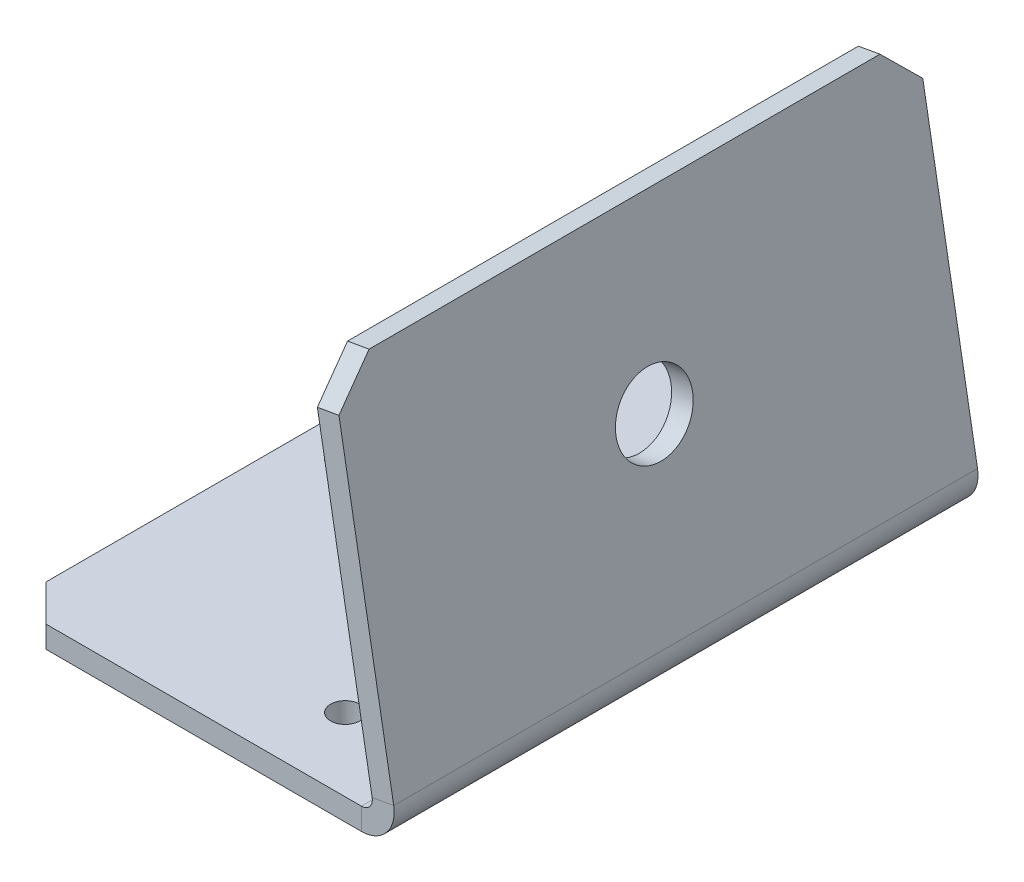
ISO-10303-21;
HEADER;
FILE_DESCRIPTION(('STEP AP214'),'2;1');
FILE_NAME('part.step','',(''),(''),'','','');
FILE_SCHEMA(('AUTOMOTIVE_DESIGN { 1 0 10303 214 1 1 1 1 }'));
ENDSEC;
DATA;
#1=APPLICATION_CONTEXT('core data for automotive mechanical design processes');
#2=APPLICATION_PROTOCOL_DEFINITION('international standard','automotive_design',2000,#1);
#3=PRODUCT_CONTEXT('',#1,'mechanical');
#4=PRODUCT('Part','Part','',(#3));
#5=PRODUCT_RELATED_PRODUCT_CATEGORY('part','',(#4));
#6=PRODUCT_DEFINITION_FORMATION('','',#4);
#7=PRODUCT_DEFINITION_CONTEXT('part definition',#1,'design');
#8=PRODUCT_DEFINITION('design','',#6,#7);
#9=PRODUCT_DEFINITION_SHAPE('','',#8);
#10=(LENGTH_UNIT() NAMED_UNIT(*) SI_UNIT(.MILLI.,.METRE.));
#11=(NAMED_UNIT(*) PLANE_ANGLE_UNIT() SI_UNIT($,.RADIAN.));
#12=(NAMED_UNIT(*) SI_UNIT($,.STERADIAN.) SOLID_ANGLE_UNIT());
#13=UNCERTAINTY_MEASURE_WITH_UNIT(LENGTH_MEASURE(1.E-05),#10,'distance_accuracy_value','');
#14=(GEOMETRIC_REPRESENTATION_CONTEXT(3) GLOBAL_UNCERTAINTY_ASSIGNED_CONTEXT((#13)) GLOBAL_UNIT_ASSIGNED_CONTEXT((#10,
#11,#12)) REPRESENTATION_CONTEXT('',''));
#15=CARTESIAN_POINT('',(0.,0.,0.));
#16=DIRECTION('',(0.,0.,1.));
#17=DIRECTION('',(1.,0.,0.));
#18=AXIS2_PLACEMENT_3D('',#15,#16,#17);
#19=CARTESIAN_POINT('',(-25.,-3.,-40.));
#20=DIRECTION('',(0.,0.,-1.));
#21=DIRECTION('',(-1.,0.,0.));
#22=AXIS2_PLACEMENT_3D('',#19,#20,#21);
#23=PLANE('',#22);
#24=DIRECTION('',(-1.,0.,0.));
#25=VECTOR('',#24,1.);
#26=CARTESIAN_POINT('',(-25.,-3.,-40.));
#27=LINE('',#26,#25);
#28=CARTESIAN_POINT('',(23.2123696111087,-3.,-40.));
#29=VERTEX_POINT('',#28);
#30=CARTESIAN_POINT('',(-20.,-3.,-40.));
#31=VERTEX_POINT('',#30);
#32=EDGE_CURVE('E196',#29,#31,#27,.T.);
#33=ORIENTED_EDGE('',*,*,#32,.T.);
#34=DIRECTION('',(0.,1.,0.));
#35=VECTOR('',#34,1.);
#36=CARTESIAN_POINT('',(-20.,-3.,-40.));
#37=LINE('',#36,#35);
#38=CARTESIAN_POINT('',(-20.,0.,-40.));
#39=VERTEX_POINT('',#38);
#40=EDGE_CURVE('E205',#31,#39,#37,.T.);
#41=ORIENTED_EDGE('',*,*,#40,.T.);
#42=DIRECTION('',(-1.,0.,0.));
#43=VECTOR('',#42,1.);
#44=CARTESIAN_POINT('',(-25.,0.,-40.));
#45=LINE('',#44,#43);
#46=CARTESIAN_POINT('',(23.2123696111087,0.,-40.));
#47=VERTEX_POINT('',#46);
#48=EDGE_CURVE('E193',#47,#39,#45,.T.);
#49=ORIENTED_EDGE('',*,*,#48,.F.);
#50=DIRECTION('',(0.,-1.,0.));
#51=VECTOR('',#50,1.);
#52=CARTESIAN_POINT('',(23.2123696111087,0.,-40.));
#53=LINE('',#52,#51);
#54=EDGE_CURVE('E182',#47,#29,#53,.T.);
#55=ORIENTED_EDGE('',*,*,#54,.T.);
#56=EDGE_LOOP('',(#33,#41,#49,#55));
#57=FACE_BOUND('',#56,.T.);
#58=ADVANCED_FACE('F46',(#57),#23,.T.);
#59=CARTESIAN_POINT('',(0.,-3.,0.));
#60=DIRECTION('',(0.,1.,0.));
#61=DIRECTION('',(0.,0.,1.));
#62=AXIS2_PLACEMENT_3D('',#59,#60,#61);
#63=PLANE('',#62);
#64=CARTESIAN_POINT('',(11.,-3.,-30.));
#65=DIRECTION('',(0.,-1.,0.));
#66=DIRECTION('',(0.,0.,1.));
#67=AXIS2_PLACEMENT_3D('',#64,#65,#66);
#68=CIRCLE('',#67,2.);
#69=CARTESIAN_POINT('',(11.,-3.,-32.));
#70=VERTEX_POINT('',#69);
#71=EDGE_CURVE('E289',#70,#70,#68,.T.);
#72=ORIENTED_EDGE('',*,*,#71,.F.);
#73=EDGE_LOOP('',(#72));
#74=FACE_BOUND('',#73,.T.);
#75=CARTESIAN_POINT('',(11.,-3.,30.));
#76=DIRECTION('',(0.,-1.,0.));
#77=DIRECTION('',(0.,0.,-1.));
#78=AXIS2_PLACEMENT_3D('',#75,#76,#77);
#79=CIRCLE('',#78,2.);
#80=CARTESIAN_POINT('',(11.,-3.,28.));
#81=VERTEX_POINT('',#80);
#82=EDGE_CURVE('E283',#81,#81,#79,.T.);
#83=ORIENTED_EDGE('',*,*,#82,.F.);
#84=EDGE_LOOP('',(#83));
#85=FACE_BOUND('',#84,.T.);
#86=CARTESIAN_POINT('',(-19.,-3.,0.));
#87=DIRECTION('',(0.,-1.,0.));
#88=DIRECTION('',(0.,0.,-1.));
#89=AXIS2_PLACEMENT_3D('',#86,#87,#88);
#90=CIRCLE('',#89,2.);
#91=CARTESIAN_POINT('',(-19.,-3.,-2.));
#92=VERTEX_POINT('',#91);
#93=EDGE_CURVE('E279',#92,#92,#90,.T.);
#94=ORIENTED_EDGE('',*,*,#93,.F.);
#95=EDGE_LOOP('',(#94));
#96=FACE_BOUND('',#95,.T.);
#97=DIRECTION('',(0.,0.,1.));
#98=VECTOR('',#97,1.);
#99=CARTESIAN_POINT('',(-25.,-3.,-40.));
#100=LINE('',#99,#98);
#101=CARTESIAN_POINT('',(-25.,-3.,-35.));
#102=VERTEX_POINT('',#101);
#103=CARTESIAN_POINT('',(-25.,-3.,35.));
#104=VERTEX_POINT('',#103);
#105=EDGE_CURVE('E199',#102,#104,#100,.T.);
#106=ORIENTED_EDGE('',*,*,#105,.F.);
#107=DIRECTION('',(-0.707106781186547,0.,0.707106781186549));
#108=VECTOR('',#107,1.);
#109=CARTESIAN_POINT('',(-20.,-3.,-40.));
#110=LINE('',#109,#108);
#111=EDGE_CURVE('E225',#102,#31,#110,.F.);
#112=ORIENTED_EDGE('',*,*,#111,.T.);
#113=ORIENTED_EDGE('',*,*,#32,.F.);
#114=DIRECTION('',(0.,0.,-1.));
#115=VECTOR('',#114,1.);
#116=CARTESIAN_POINT('',(23.2123696111087,-3.,-40.));
#117=LINE('',#116,#115);
#118=CARTESIAN_POINT('',(23.2123696111087,-3.,40.));
#119=VERTEX_POINT('',#118);
#120=EDGE_CURVE('E148',#29,#119,#117,.F.);
#121=ORIENTED_EDGE('',*,*,#120,.T.);
#122=DIRECTION('',(1.,0.,0.));
#123=VECTOR('',#122,1.);
#124=CARTESIAN_POINT('',(-25.,-3.,40.));
#125=LINE('',#124,#123);
#126=CARTESIAN_POINT('',(-19.9999999999999,-3.,40.));
#127=VERTEX_POINT('',#126);
#128=EDGE_CURVE('E203',#127,#119,#125,.T.);
#129=ORIENTED_EDGE('',*,*,#128,.F.);
#130=DIRECTION('',(0.707106781186549,0.,0.707106781186546));
#131=VECTOR('',#130,1.);
#132=CARTESIAN_POINT('',(-25.,-3.,35.));
#133=LINE('',#132,#131);
#134=EDGE_CURVE('E223',#127,#104,#133,.F.);
#135=ORIENTED_EDGE('',*,*,#134,.T.);
#136=EDGE_LOOP('',(#106,#112,#113,#121,#129,#135));
#137=FACE_BOUND('',#136,.T.);
#138=ADVANCED_FACE('F250',(#74,#85,#96,#137),#63,.F.);
#139=CARTESIAN_POINT('',(0.,0.,0.));
#140=DIRECTION('',(0.,1.,0.));
#141=DIRECTION('',(0.,0.,1.));
#142=AXIS2_PLACEMENT_3D('',#139,#140,#141);
#143=PLANE('',#142);
#144=CARTESIAN_POINT('',(11.,0.,-30.));
#145=DIRECTION('',(0.,1.,0.));
#146=DIRECTION('',(0.,0.,1.));
#147=AXIS2_PLACEMENT_3D('',#144,#145,#146);
#148=CIRCLE('',#147,2.);
#149=CARTESIAN_POINT('',(11.,0.,-32.));
#150=VERTEX_POINT('',#149);
#151=EDGE_CURVE('E292',#150,#150,#148,.F.);
#152=ORIENTED_EDGE('',*,*,#151,.T.);
#153=EDGE_LOOP('',(#152));
#154=FACE_BOUND('',#153,.T.);
#155=CARTESIAN_POINT('',(11.,0.,30.));
#156=DIRECTION('',(0.,1.,0.));
#157=DIRECTION('',(0.,0.,1.));
#158=AXIS2_PLACEMENT_3D('',#155,#156,#157);
#159=CIRCLE('',#158,2.);
#160=CARTESIAN_POINT('',(11.,0.,28.));
#161=VERTEX_POINT('',#160);
#162=EDGE_CURVE('E286',#161,#161,#159,.F.);
#163=ORIENTED_EDGE('',*,*,#162,.T.);
#164=EDGE_LOOP('',(#163));
#165=FACE_BOUND('',#164,.T.);
#166=CARTESIAN_POINT('',(-19.,0.,0.));
#167=DIRECTION('',(0.,1.,0.));
#168=DIRECTION('',(0.,0.,1.));
#169=AXIS2_PLACEMENT_3D('',#166,#167,#168);
#170=CIRCLE('',#169,2.);
#171=CARTESIAN_POINT('',(-19.,0.,-2.));
#172=VERTEX_POINT('',#171);
#173=EDGE_CURVE('E280',#172,#172,#170,.F.);
#174=ORIENTED_EDGE('',*,*,#173,.T.);
#175=EDGE_LOOP('',(#174));
#176=FACE_BOUND('',#175,.T.);
#177=ORIENTED_EDGE('',*,*,#48,.T.);
#178=DIRECTION('',(0.707106781186547,0.,-0.707106781186549));
#179=VECTOR('',#178,1.);
#180=CARTESIAN_POINT('',(-30.,0.,-30.));
#181=LINE('',#180,#179);
#182=CARTESIAN_POINT('',(-25.,0.,-35.));
#183=VERTEX_POINT('',#182);
#184=EDGE_CURVE('E216',#39,#183,#181,.F.);
#185=ORIENTED_EDGE('',*,*,#184,.T.);
#186=DIRECTION('',(0.,0.,1.));
#187=VECTOR('',#186,1.);
#188=CARTESIAN_POINT('',(-25.,0.,-40.));
#189=LINE('',#188,#187);
#190=CARTESIAN_POINT('',(-25.,0.,35.));
#191=VERTEX_POINT('',#190);
#192=EDGE_CURVE('E208',#183,#191,#189,.T.);
#193=ORIENTED_EDGE('',*,*,#192,.T.);
#194=DIRECTION('',(-0.707106781186549,0.,-0.707106781186546));
#195=VECTOR('',#194,1.);
#196=CARTESIAN_POINT('',(-29.9999999999999,0.,30.0000000000001));
#197=LINE('',#196,#195);
#198=CARTESIAN_POINT('',(-19.9999999999999,0.,40.));
#199=VERTEX_POINT('',#198);
#200=EDGE_CURVE('E214',#191,#199,#197,.F.);
#201=ORIENTED_EDGE('',*,*,#200,.T.);
#202=DIRECTION('',(1.,0.,0.));
#203=VECTOR('',#202,1.);
#204=CARTESIAN_POINT('',(-25.,0.,40.));
#205=LINE('',#204,#203);
#206=CARTESIAN_POINT('',(23.2123696111087,0.,40.));
#207=VERTEX_POINT('',#206);
#208=EDGE_CURVE('E200',#199,#207,#205,.T.);
#209=ORIENTED_EDGE('',*,*,#208,.T.);
#210=DIRECTION('',(0.,0.,-1.));
#211=VECTOR('',#210,1.);
#212=CARTESIAN_POINT('',(23.2123696111087,0.,-40.));
#213=LINE('',#212,#211);
#214=EDGE_CURVE('E186',#47,#207,#213,.F.);
#215=ORIENTED_EDGE('',*,*,#214,.F.);
#216=EDGE_LOOP('',(#177,#185,#193,#201,#209,#215));
#217=FACE_BOUND('',#216,.T.);
#218=ADVANCED_FACE('F258',(#154,#165,#176,#217),#143,.T.);
#219=CARTESIAN_POINT('',(-25.,-3.,40.));
#220=DIRECTION('',(0.,0.,1.));
#221=DIRECTION('',(1.,0.,0.));
#222=AXIS2_PLACEMENT_3D('',#219,#220,#221);
#223=PLANE('',#222);
#224=ORIENTED_EDGE('',*,*,#208,.F.);
#225=DIRECTION('',(0.,-1.,0.));
#226=VECTOR('',#225,1.);
#227=CARTESIAN_POINT('',(-19.9999999999999,-3.,40.));
#228=LINE('',#227,#226);
#229=EDGE_CURVE('E55',#199,#127,#228,.T.);
#230=ORIENTED_EDGE('',*,*,#229,.T.);
#231=ORIENTED_EDGE('',*,*,#128,.T.);
#232=DIRECTION('',(0.,-1.,0.));
#233=VECTOR('',#232,1.);
#234=CARTESIAN_POINT('',(23.2123696111087,0.,40.));
#235=LINE('',#234,#233);
#236=EDGE_CURVE('E190',#207,#119,#235,.T.);
#237=ORIENTED_EDGE('',*,*,#236,.F.);
#238=EDGE_LOOP('',(#224,#230,#231,#237));
#239=FACE_BOUND('',#238,.T.);
#240=ADVANCED_FACE('F244',(#239),#223,.T.);
#241=CARTESIAN_POINT('',(-25.,-3.,-40.));
#242=DIRECTION('',(-1.,0.,0.));
#243=DIRECTION('',(0.,0.,1.));
#244=AXIS2_PLACEMENT_3D('',#241,#242,#243);
#245=PLANE('',#244);
#246=ORIENTED_EDGE('',*,*,#192,.F.);
#247=DIRECTION('',(0.,-1.,0.));
#248=VECTOR('',#247,1.);
#249=CARTESIAN_POINT('',(-25.,-3.,-35.));
#250=LINE('',#249,#248);
#251=EDGE_CURVE('E221',#183,#102,#250,.T.);
#252=ORIENTED_EDGE('',*,*,#251,.T.);
#253=ORIENTED_EDGE('',*,*,#105,.T.);
#254=DIRECTION('',(0.,1.,0.));
#255=VECTOR('',#254,1.);
#256=CARTESIAN_POINT('',(-25.,-3.,35.));
#257=LINE('',#256,#255);
#258=EDGE_CURVE('E218',#104,#191,#257,.T.);
#259=ORIENTED_EDGE('',*,*,#258,.T.);
#260=EDGE_LOOP('',(#246,#252,#253,#259));
#261=FACE_BOUND('',#260,.T.);
#262=ADVANCED_FACE('F255',(#261),#245,.T.);
#263=CARTESIAN_POINT('',(23.2123696111087,1.5,40.));
#264=DIRECTION('',(0.,0.,1.));
#265=DIRECTION('',(1.,0.,0.));
#266=AXIS2_PLACEMENT_3D('',#263,#264,#265);
#267=PLANE('',#266);
#268=DIRECTION('',(0.984807753012209,0.173648177666927,0.));
#269=VECTOR('',#268,1.);
#270=CARTESIAN_POINT('',(24.689581240627,1.76047226650039,40.));
#271=LINE('',#270,#269);
#272=CARTESIAN_POINT('',(24.689581240627,1.76047226650039,40.));
#273=VERTEX_POINT('',#272);
#274=CARTESIAN_POINT('',(27.6440044996636,2.28141679950118,40.));
#275=VERTEX_POINT('',#274);
#276=EDGE_CURVE('E271',#273,#275,#271,.T.);
#277=ORIENTED_EDGE('',*,*,#276,.F.);
#278=CARTESIAN_POINT('',(23.2123696111087,1.5,40.));
#279=DIRECTION('',(0.,0.,-1.));
#280=DIRECTION('',(-1.,0.,0.));
#281=AXIS2_PLACEMENT_3D('',#278,#279,#280);
#282=CIRCLE('',#281,1.5);
#283=EDGE_CURVE('E151',#207,#273,#282,.F.);
#284=ORIENTED_EDGE('',*,*,#283,.F.);
#285=ORIENTED_EDGE('',*,*,#236,.T.);
#286=CARTESIAN_POINT('',(23.2123696111087,1.5,40.));
#287=DIRECTION('',(0.,0.,-1.));
#288=DIRECTION('',(-1.,0.,0.));
#289=AXIS2_PLACEMENT_3D('',#286,#287,#288);
#290=CIRCLE('',#289,4.5);
#291=EDGE_CURVE('E181',#119,#275,#290,.F.);
#292=ORIENTED_EDGE('',*,*,#291,.T.);
#293=EDGE_LOOP('',(#277,#284,#285,#292));
#294=FACE_BOUND('',#293,.T.);
#295=ADVANCED_FACE('F369',(#294),#267,.T.);
#296=CARTESIAN_POINT('',(23.2123696111087,1.5,-40.));
#297=DIRECTION('',(0.,0.,1.));
#298=DIRECTION('',(1.,0.,0.));
#299=AXIS2_PLACEMENT_3D('',#296,#297,#298);
#300=PLANE('',#299);
#301=CARTESIAN_POINT('',(23.2123696111087,1.5,-40.));
#302=DIRECTION('',(0.,0.,-1.));
#303=DIRECTION('',(-1.,0.,0.));
#304=AXIS2_PLACEMENT_3D('',#301,#302,#303);
#305=CIRCLE('',#304,1.5);
#306=CARTESIAN_POINT('',(24.689581240627,1.76047226650039,-40.));
#307=VERTEX_POINT('',#306);
#308=EDGE_CURVE('E158',#307,#47,#305,.T.);
#309=ORIENTED_EDGE('',*,*,#308,.F.);
#310=DIRECTION('',(0.984807753012209,0.173648177666927,0.));
#311=VECTOR('',#310,1.);
#312=CARTESIAN_POINT('',(24.689581240627,1.76047226650039,-40.));
#313=LINE('',#312,#311);
#314=CARTESIAN_POINT('',(27.6440044996636,2.28141679950118,-40.));
#315=VERTEX_POINT('',#314);
#316=EDGE_CURVE('E155',#307,#315,#313,.T.);
#317=ORIENTED_EDGE('',*,*,#316,.T.);
#318=CARTESIAN_POINT('',(23.2123696111087,1.5,-40.));
#319=DIRECTION('',(0.,0.,-1.));
#320=DIRECTION('',(-1.,0.,0.));
#321=AXIS2_PLACEMENT_3D('',#318,#319,#320);
#322=CIRCLE('',#321,4.5);
#323=EDGE_CURVE('E140',#315,#29,#322,.T.);
#324=ORIENTED_EDGE('',*,*,#323,.T.);
#325=ORIENTED_EDGE('',*,*,#54,.F.);
#326=EDGE_LOOP('',(#309,#317,#324,#325));
#327=FACE_BOUND('',#326,.T.);
#328=ADVANCED_FACE('F156',(#327),#300,.F.);
#329=CARTESIAN_POINT('',(23.2123696111087,1.5,-40.));
#330=DIRECTION('',(0.,0.,-1.));
#331=DIRECTION('',(0.984807753012209,0.173648177666927,0.));
#332=AXIS2_PLACEMENT_3D('',#329,#330,#331);
#333=CYLINDRICAL_SURFACE('',#332,4.5);
#334=ORIENTED_EDGE('',*,*,#120,.F.);
#335=ORIENTED_EDGE('',*,*,#323,.F.);
#336=DIRECTION('',(0.,0.,1.));
#337=VECTOR('',#336,1.);
#338=CARTESIAN_POINT('',(27.6440044996636,2.28141679950118,0.));
#339=LINE('',#338,#337);
#340=EDGE_CURVE('E145',#315,#275,#339,.T.);
#341=ORIENTED_EDGE('',*,*,#340,.T.);
#342=ORIENTED_EDGE('',*,*,#291,.F.);
#343=EDGE_LOOP('',(#334,#335,#341,#342));
#344=FACE_BOUND('',#343,.T.);
#345=ADVANCED_FACE('F142',(#344),#333,.T.);
#346=CARTESIAN_POINT('',(23.2123696111087,1.5,-40.));
#347=DIRECTION('',(0.,0.,-1.));
#348=DIRECTION('',(0.984807753012209,0.173648177666927,0.));
#349=AXIS2_PLACEMENT_3D('',#346,#347,#348);
#350=CYLINDRICAL_SURFACE('',#349,1.5);
#351=ORIENTED_EDGE('',*,*,#214,.T.);
#352=ORIENTED_EDGE('',*,*,#283,.T.);
#353=DIRECTION('',(0.,0.,-1.));
#354=VECTOR('',#353,1.);
#355=CARTESIAN_POINT('',(24.689581240627,1.76047226650039,40.));
#356=LINE('',#355,#354);
#357=EDGE_CURVE('E160',#273,#307,#356,.T.);
#358=ORIENTED_EDGE('',*,*,#357,.T.);
#359=ORIENTED_EDGE('',*,*,#308,.T.);
#360=EDGE_LOOP('',(#351,#352,#358,#359));
#361=FACE_BOUND('',#360,.T.);
#362=ADVANCED_FACE('F266',(#361),#350,.F.);
#363=CARTESIAN_POINT('',(27.9544232590366,0.520944533000781,40.));
#364=DIRECTION('',(0.,0.,-1.));
#365=DIRECTION('',(-1.,0.,0.));
#366=AXIS2_PLACEMENT_3D('',#363,#364,#365);
#367=PLANE('',#366);
#368=DIRECTION('',(0.173648177666927,-0.984807753012209,0.));
#369=VECTOR('',#368,1.);
#370=CARTESIAN_POINT('',(27.9544232590366,0.520944533000781,40.));
#371=LINE('',#370,#369);
#372=CARTESIAN_POINT('',(20.1402552640249,44.8372934185502,40.));
#373=VERTEX_POINT('',#372);
#374=EDGE_CURVE('E165',#373,#275,#371,.T.);
#375=ORIENTED_EDGE('',*,*,#374,.F.);
#376=DIRECTION('',(-0.984807753012209,-0.173648177666927,0.));
#377=VECTOR('',#376,1.);
#378=CARTESIAN_POINT('',(20.1402552640249,44.8372934185502,40.));
#379=LINE('',#378,#377);
#380=CARTESIAN_POINT('',(17.1858320049883,44.3163488855494,40.));
#381=VERTEX_POINT('',#380);
#382=EDGE_CURVE('E13',#373,#381,#379,.T.);
#383=ORIENTED_EDGE('',*,*,#382,.T.);
#384=DIRECTION('',(0.173648177666927,-0.984807753012209,0.));
#385=VECTOR('',#384,1.);
#386=CARTESIAN_POINT('',(25.,0.,40.));
#387=LINE('',#386,#385);
#388=EDGE_CURVE('E166',#381,#273,#387,.T.);
#389=ORIENTED_EDGE('',*,*,#388,.T.);
#390=ORIENTED_EDGE('',*,*,#276,.T.);
#391=EDGE_LOOP('',(#375,#383,#389,#390));
#392=FACE_BOUND('',#391,.T.);
#393=ADVANCED_FACE('F345',(#392),#367,.F.);
#394=CARTESIAN_POINT('',(19.2720143756903,49.7613321836112,-40.));
#395=DIRECTION('',(0.,0.,1.));
#396=DIRECTION('',(1.,0.,0.));
#397=AXIS2_PLACEMENT_3D('',#394,#395,#396);
#398=PLANE('',#397);
#399=DIRECTION('',(-0.173648177666927,0.984807753012209,0.));
#400=VECTOR('',#399,1.);
#401=CARTESIAN_POINT('',(16.3175911166536,49.2403876506104,-40.));
#402=LINE('',#401,#400);
#403=CARTESIAN_POINT('',(17.1858320049883,44.3163488855494,-40.));
#404=VERTEX_POINT('',#403);
#405=EDGE_CURVE('E176',#307,#404,#402,.T.);
#406=ORIENTED_EDGE('',*,*,#405,.T.);
#407=DIRECTION('',(0.984807753012209,0.173648177666927,0.));
#408=VECTOR('',#407,1.);
#409=CARTESIAN_POINT('',(20.1402552640249,44.8372934185501,-40.));
#410=LINE('',#409,#408);
#411=CARTESIAN_POINT('',(20.1402552640249,44.8372934185501,-40.));
#412=VERTEX_POINT('',#411);
#413=EDGE_CURVE('E70',#404,#412,#410,.T.);
#414=ORIENTED_EDGE('',*,*,#413,.T.);
#415=DIRECTION('',(-0.173648177666927,0.984807753012209,0.));
#416=VECTOR('',#415,1.);
#417=CARTESIAN_POINT('',(19.2720143756903,49.7613321836112,-40.));
#418=LINE('',#417,#416);
#419=EDGE_CURVE('E163',#315,#412,#418,.T.);
#420=ORIENTED_EDGE('',*,*,#419,.F.);
#421=ORIENTED_EDGE('',*,*,#316,.F.);
#422=EDGE_LOOP('',(#406,#414,#420,#421));
#423=FACE_BOUND('',#422,.T.);
#424=ADVANCED_FACE('F168',(#423),#398,.F.);
#425=CARTESIAN_POINT('',(27.2005810188605,4.79619632457157,0.));
#426=DIRECTION('',(-0.984807753012209,-0.173648177666927,0.));
#427=DIRECTION('',(0.173648177666927,-0.984807753012209,0.));
#428=AXIS2_PLACEMENT_3D('',#425,#426,#427);
#429=PLANE('',#428);
#430=CARTESIAN_POINT('',(23.3527465508631,26.6183499878243,0.));
#431=DIRECTION('',(0.984807753012209,0.173648177666927,0.));
#432=DIRECTION('',(-0.173648177666927,0.984807753012209,0.));
#433=AXIS2_PLACEMENT_3D('',#430,#431,#432);
#434=CIRCLE('',#433,5.25);
#435=CARTESIAN_POINT('',(22.4410936181117,31.7885906911384,0.));
#436=VERTEX_POINT('',#435);
#437=EDGE_CURVE('E276',#436,#436,#434,.T.);
#438=ORIENTED_EDGE('',*,*,#437,.F.);
#439=EDGE_LOOP('',(#438));
#440=FACE_BOUND('',#439,.T.);
#441=ORIENTED_EDGE('',*,*,#419,.T.);
#442=DIRECTION('',(0.122787803968971,-0.696364240320022,-0.707106781186545));
#443=VECTOR('',#442,1.);
#444=CARTESIAN_POINT('',(19.2720143756903,49.7613321836112,-35.));
#445=LINE('',#444,#443);
#446=CARTESIAN_POINT('',(19.2720143756903,49.7613321836112,-35.));
#447=VERTEX_POINT('',#446);
#448=EDGE_CURVE('E238',#412,#447,#445,.F.);
#449=ORIENTED_EDGE('',*,*,#448,.T.);
#450=DIRECTION('',(0.,0.,1.));
#451=VECTOR('',#450,1.);
#452=CARTESIAN_POINT('',(19.2720143756903,49.7613321836112,40.));
#453=LINE('',#452,#451);
#454=CARTESIAN_POINT('',(19.2720143756903,49.7613321836112,35.));
#455=VERTEX_POINT('',#454);
#456=EDGE_CURVE('E169',#447,#455,#453,.T.);
#457=ORIENTED_EDGE('',*,*,#456,.T.);
#458=DIRECTION('',(-0.12278780396897,0.696364240320017,-0.70710678118655));
#459=VECTOR('',#458,1.);
#460=CARTESIAN_POINT('',(20.1402552640249,44.8372934185502,40.));
#461=LINE('',#460,#459);
#462=EDGE_CURVE('E62',#455,#373,#461,.F.);
#463=ORIENTED_EDGE('',*,*,#462,.T.);
#464=ORIENTED_EDGE('',*,*,#374,.T.);
#465=ORIENTED_EDGE('',*,*,#340,.F.);
#466=EDGE_LOOP('',(#441,#449,#457,#463,#464,#465));
#467=FACE_BOUND('',#466,.T.);
#468=ADVANCED_FACE('F162',(#440,#467),#429,.F.);
#469=CARTESIAN_POINT('',(24.2461577598239,4.27525179157078,0.));
#470=DIRECTION('',(-0.984807753012209,-0.173648177666927,0.));
#471=DIRECTION('',(0.173648177666927,-0.984807753012209,0.));
#472=AXIS2_PLACEMENT_3D('',#469,#470,#471);
#473=PLANE('',#472);
#474=CARTESIAN_POINT('',(20.3983232918264,26.0974054548236,0.));
#475=DIRECTION('',(-0.984807753012209,-0.173648177666927,0.));
#476=DIRECTION('',(0.173648177666927,-0.984807753012209,0.));
#477=AXIS2_PLACEMENT_3D('',#474,#475,#476);
#478=CIRCLE('',#477,5.25);
#479=CARTESIAN_POINT('',(21.3099762245778,20.9271647515095,0.));
#480=VERTEX_POINT('',#479);
#481=EDGE_CURVE('E50',#480,#480,#478,.T.);
#482=ORIENTED_EDGE('',*,*,#481,.F.);
#483=EDGE_LOOP('',(#482));
#484=FACE_BOUND('',#483,.T.);
#485=DIRECTION('',(0.,0.,1.));
#486=VECTOR('',#485,1.);
#487=CARTESIAN_POINT('',(16.3175911166536,49.2403876506104,40.));
#488=LINE('',#487,#486);
#489=CARTESIAN_POINT('',(16.3175911166536,49.2403876506104,-35.));
#490=VERTEX_POINT('',#489);
#491=CARTESIAN_POINT('',(16.3175911166536,49.2403876506104,35.));
#492=VERTEX_POINT('',#491);
#493=EDGE_CURVE('E172',#490,#492,#488,.T.);
#494=ORIENTED_EDGE('',*,*,#493,.F.);
#495=DIRECTION('',(-0.122787803968971,0.696364240320022,0.707106781186545));
#496=VECTOR('',#495,1.);
#497=CARTESIAN_POINT('',(17.2430313290676,43.9919553988041,-40.3293977791636));
#498=LINE('',#497,#496);
#499=EDGE_CURVE('E234',#490,#404,#498,.F.);
#500=ORIENTED_EDGE('',*,*,#499,.T.);
#501=ORIENTED_EDGE('',*,*,#405,.F.);
#502=ORIENTED_EDGE('',*,*,#357,.F.);
#503=ORIENTED_EDGE('',*,*,#388,.F.);
#504=DIRECTION('',(0.12278780396897,-0.696364240320017,0.70710678118655));
#505=VECTOR('',#504,1.);
#506=CARTESIAN_POINT('',(17.2430313290675,43.9919553988044,40.3293977791633));
#507=LINE('',#506,#505);
#508=EDGE_CURVE('E232',#381,#492,#507,.F.);
#509=ORIENTED_EDGE('',*,*,#508,.T.);
#510=EDGE_LOOP('',(#494,#500,#501,#502,#503,#509));
#511=FACE_BOUND('',#510,.T.);
#512=ADVANCED_FACE('F348',(#484,#511),#473,.T.);
#513=CARTESIAN_POINT('',(19.2720143756903,49.7613321836112,40.));
#514=DIRECTION('',(0.173648177666927,-0.984807753012209,0.));
#515=DIRECTION('',(0.984807753012209,0.173648177666927,0.));
#516=AXIS2_PLACEMENT_3D('',#513,#514,#515);
#517=PLANE('',#516);
#518=ORIENTED_EDGE('',*,*,#456,.F.);
#519=DIRECTION('',(-0.984807753012209,-0.173648177666927,0.));
#520=VECTOR('',#519,1.);
#521=CARTESIAN_POINT('',(19.2720143756903,49.7613321836112,-35.));
#522=LINE('',#521,#520);
#523=EDGE_CURVE('E229',#447,#490,#522,.T.);
#524=ORIENTED_EDGE('',*,*,#523,.T.);
#525=ORIENTED_EDGE('',*,*,#493,.T.);
#526=DIRECTION('',(0.984807753012209,0.173648177666927,0.));
#527=VECTOR('',#526,1.);
#528=CARTESIAN_POINT('',(19.2720143756903,49.7613321836112,35.));
#529=LINE('',#528,#527);
#530=EDGE_CURVE('E227',#492,#455,#529,.T.);
#531=ORIENTED_EDGE('',*,*,#530,.T.);
#532=EDGE_LOOP('',(#518,#524,#525,#531));
#533=FACE_BOUND('',#532,.T.);
#534=ADVANCED_FACE('F332',(#533),#517,.F.);
#535=CARTESIAN_POINT('',(-20.,-3.,-40.));
#536=DIRECTION('',(0.707106781186549,0.,0.707106781186547));
#537=DIRECTION('',(0.,1.,0.));
#538=AXIS2_PLACEMENT_3D('',#535,#536,#537);
#539=PLANE('',#538);
#540=ORIENTED_EDGE('',*,*,#111,.F.);
#541=ORIENTED_EDGE('',*,*,#251,.F.);
#542=ORIENTED_EDGE('',*,*,#184,.F.);
#543=ORIENTED_EDGE('',*,*,#40,.F.);
#544=EDGE_LOOP('',(#540,#541,#542,#543));
#545=FACE_BOUND('',#544,.T.);
#546=ADVANCED_FACE('F263',(#545),#539,.F.);
#547=CARTESIAN_POINT('',(19.2720143756903,49.7613321836112,-35.));
#548=DIRECTION('',(0.12278780396897,-0.696364240320016,0.70710678118655));
#549=DIRECTION('',(-0.984807753012209,-0.173648177666927,0.));
#550=AXIS2_PLACEMENT_3D('',#547,#548,#549);
#551=PLANE('',#550);
#552=ORIENTED_EDGE('',*,*,#448,.F.);
#553=ORIENTED_EDGE('',*,*,#413,.F.);
#554=ORIENTED_EDGE('',*,*,#499,.F.);
#555=ORIENTED_EDGE('',*,*,#523,.F.);
#556=EDGE_LOOP('',(#552,#553,#554,#555));
#557=FACE_BOUND('',#556,.T.);
#558=ADVANCED_FACE('F331',(#557),#551,.F.);
#559=CARTESIAN_POINT('',(-25.,-3.,35.));
#560=DIRECTION('',(0.707106781186545,0.,-0.707106781186549));
#561=DIRECTION('',(0.,1.,0.));
#562=AXIS2_PLACEMENT_3D('',#559,#560,#561);
#563=PLANE('',#562);
#564=ORIENTED_EDGE('',*,*,#134,.F.);
#565=ORIENTED_EDGE('',*,*,#229,.F.);
#566=ORIENTED_EDGE('',*,*,#200,.F.);
#567=ORIENTED_EDGE('',*,*,#258,.F.);
#568=EDGE_LOOP('',(#564,#565,#566,#567));
#569=FACE_BOUND('',#568,.T.);
#570=ADVANCED_FACE('F252',(#569),#563,.F.);
#571=CARTESIAN_POINT('',(20.1402552640249,44.8372934185502,40.));
#572=DIRECTION('',(0.122787803968971,-0.696364240320021,-0.707106781186545));
#573=DIRECTION('',(-0.984807753012209,-0.173648177666927,0.));
#574=AXIS2_PLACEMENT_3D('',#571,#572,#573);
#575=PLANE('',#574);
#576=ORIENTED_EDGE('',*,*,#462,.F.);
#577=ORIENTED_EDGE('',*,*,#530,.F.);
#578=ORIENTED_EDGE('',*,*,#508,.F.);
#579=ORIENTED_EDGE('',*,*,#382,.F.);
#580=EDGE_LOOP('',(#576,#577,#578,#579));
#581=FACE_BOUND('',#580,.T.);
#582=ADVANCED_FACE('F48',(#581),#575,.F.);
#583=CARTESIAN_POINT('',(13.504669020741,24.8818682111551,0.));
#584=DIRECTION('',(0.984807753012209,0.173648177666927,0.));
#585=DIRECTION('',(-0.173648177666927,0.984807753012209,0.));
#586=AXIS2_PLACEMENT_3D('',#583,#584,#585);
#587=CYLINDRICAL_SURFACE('',#586,5.25);
#588=ORIENTED_EDGE('',*,*,#481,.T.);
#589=EDGE_LOOP('',(#588));
#590=FACE_BOUND('',#589,.T.);
#591=ORIENTED_EDGE('',*,*,#437,.T.);
#592=EDGE_LOOP('',(#591));
#593=FACE_BOUND('',#592,.T.);
#594=ADVANCED_FACE('F310',(#590,#593),#587,.F.);
#595=CARTESIAN_POINT('',(-19.,49.7623321836112,0.));
#596=DIRECTION('',(0.,-1.,0.));
#597=DIRECTION('',(0.,0.,-1.));
#598=AXIS2_PLACEMENT_3D('',#595,#596,#597);
#599=CYLINDRICAL_SURFACE('',#598,2.);
#600=CARTESIAN_POINT('',(-19.,0.,-2.));
#601=CARTESIAN_POINT('',(-19.,-0.0312500000000058,-2.));
#602=CARTESIAN_POINT('',(-19.,-0.0625000000000047,-2.));
#603=CARTESIAN_POINT('',(-19.,-0.125000000000005,-2.));
#604=CARTESIAN_POINT('',(-19.,-0.156250000000006,-2.));
#605=CARTESIAN_POINT('',(-19.,-0.218750000000006,-2.));
#606=CARTESIAN_POINT('',(-19.,-0.250000000000005,-2.));
#607=CARTESIAN_POINT('',(-19.,-0.312500000000005,-2.));
#608=CARTESIAN_POINT('',(-19.,-0.343750000000006,-2.));
#609=CARTESIAN_POINT('',(-19.,-0.406250000000006,-2.));
#610=CARTESIAN_POINT('',(-19.,-0.437500000000005,-2.));
#611=CARTESIAN_POINT('',(-19.,-0.500000000000005,-2.));
#612=CARTESIAN_POINT('',(-19.,-0.531250000000006,-2.));
#613=CARTESIAN_POINT('',(-19.,-0.593750000000006,-2.));
#614=CARTESIAN_POINT('',(-19.,-0.625000000000005,-2.));
#615=CARTESIAN_POINT('',(-19.,-0.687500000000005,-2.));
#616=CARTESIAN_POINT('',(-19.,-0.718750000000006,-2.));
#617=CARTESIAN_POINT('',(-19.,-0.781250000000006,-2.));
#618=CARTESIAN_POINT('',(-19.,-0.812500000000005,-2.));
#619=CARTESIAN_POINT('',(-19.,-0.875000000000003,-2.));
#620=CARTESIAN_POINT('',(-19.,-0.906250000000002,-2.));
#621=CARTESIAN_POINT('',(-19.,-0.968750000000002,-2.));
#622=CARTESIAN_POINT('',(-19.,-1.,-2.));
#623=CARTESIAN_POINT('',(-19.,-1.0625,-2.));
#624=CARTESIAN_POINT('',(-19.,-1.09375,-2.));
#625=CARTESIAN_POINT('',(-19.,-1.15625,-2.));
#626=CARTESIAN_POINT('',(-19.,-1.1875,-2.));
#627=CARTESIAN_POINT('',(-19.,-1.25,-2.));
#628=CARTESIAN_POINT('',(-19.,-1.28125,-2.));
#629=CARTESIAN_POINT('',(-19.,-1.34375,-2.));
#630=CARTESIAN_POINT('',(-19.,-1.375,-2.));
#631=CARTESIAN_POINT('',(-19.,-1.4375,-2.));
#632=CARTESIAN_POINT('',(-19.,-1.46875,-2.));
#633=CARTESIAN_POINT('',(-19.,-1.53125,-2.));
#634=CARTESIAN_POINT('',(-19.,-1.5625,-2.));
#635=CARTESIAN_POINT('',(-19.,-1.625,-2.));
#636=CARTESIAN_POINT('',(-19.,-1.65625,-2.));
#637=CARTESIAN_POINT('',(-19.,-1.71875,-2.));
#638=CARTESIAN_POINT('',(-19.,-1.75,-2.));
#639=CARTESIAN_POINT('',(-19.,-1.8125,-2.));
#640=CARTESIAN_POINT('',(-19.,-1.84375,-2.));
#641=CARTESIAN_POINT('',(-19.,-1.90625,-2.));
#642=CARTESIAN_POINT('',(-19.,-1.9375,-2.));
#643=CARTESIAN_POINT('',(-19.,-2.,-2.));
#644=CARTESIAN_POINT('',(-19.,-2.03125,-2.));
#645=CARTESIAN_POINT('',(-19.,-2.09375,-2.));
#646=CARTESIAN_POINT('',(-19.,-2.125,-2.));
#647=CARTESIAN_POINT('',(-19.,-2.1875,-2.));
#648=CARTESIAN_POINT('',(-19.,-2.21875,-2.));
#649=CARTESIAN_POINT('',(-19.,-2.28125,-2.));
#650=CARTESIAN_POINT('',(-19.,-2.3125,-2.));
#651=CARTESIAN_POINT('',(-19.,-2.375,-2.));
#652=CARTESIAN_POINT('',(-19.,-2.40625,-2.));
#653=CARTESIAN_POINT('',(-19.,-2.46875,-2.));
#654=CARTESIAN_POINT('',(-19.,-2.5,-2.));
#655=CARTESIAN_POINT('',(-19.,-2.5625,-2.));
#656=CARTESIAN_POINT('',(-19.,-2.59375,-2.));
#657=CARTESIAN_POINT('',(-19.,-2.65625,-2.));
#658=CARTESIAN_POINT('',(-19.,-2.6875,-2.));
#659=CARTESIAN_POINT('',(-19.,-2.75,-2.));
#660=CARTESIAN_POINT('',(-19.,-2.78125,-2.));
#661=CARTESIAN_POINT('',(-19.,-2.84375,-2.));
#662=CARTESIAN_POINT('',(-19.,-2.875,-2.));
#663=CARTESIAN_POINT('',(-19.,-2.9375,-2.));
#664=CARTESIAN_POINT('',(-19.,-2.96875,-2.));
#665=CARTESIAN_POINT('',(-19.,-3.,-2.));
#666=B_SPLINE_CURVE_WITH_KNOTS('',3,(#600,#601,#602,#603,#604,#605,#606,#607,#608,#609,#610,
#611,#612,#613,#614,#615,#616,#617,#618,#619,#620,#621,#622,#623,#624,#625,#626,#627,#628,#629,
#630,#631,#632,#633,#634,#635,#636,#637,#638,#639,#640,#641,#642,#643,#644,#645,#646,#647,#648,
#649,#650,#651,#652,#653,#654,#655,#656,#657,#658,#659,#660,#661,#662,#663,#664,#665),
.UNSPECIFIED.,.F.,.F.,(4,2,2,2,2,2,2,2,2,2,2,2,2,2,2,2,2,2,2,2,2,2,2,2,2,2,2,2,2,2,2,2,4),(0.,
0.0937499999999966,0.1875,0.281249999999997,0.375,0.468749999999997,0.5625,0.656249999999997,
0.750000000000001,0.843749999999997,0.937499999999994,1.03125,1.12499999999999,1.21875,
1.31249999999999,1.40625,1.49999999999999,1.59374999999999,1.68749999999999,1.78124999999999,
1.87499999999999,1.96874999999999,2.06249999999999,2.15624999999999,2.24999999999999,
2.34374999999999,2.43749999999999,2.53124999999999,2.62499999999999,2.71874999999999,
2.81249999999999,2.90624999999999,2.99999999999999),.UNSPECIFIED.);
#667=EDGE_CURVE('BSEAM307',#172,#92,#666,.T.);
#668=ORIENTED_EDGE('',*,*,#173,.F.);
#669=ORIENTED_EDGE('',*,*,#93,.T.);
#670=ORIENTED_EDGE('',*,*,#667,.T.);
#671=ORIENTED_EDGE('',*,*,#667,.F.);
#672=EDGE_LOOP('',(#668,#670,#669,#671));
#673=FACE_BOUND('',#672,.T.);
#674=ADVANCED_FACE('F307',(#673),#599,.F.);
#675=CARTESIAN_POINT('',(11.,49.7623321836112,30.));
#676=DIRECTION('',(0.,-1.,0.));
#677=DIRECTION('',(0.,0.,-1.));
#678=AXIS2_PLACEMENT_3D('',#675,#676,#677);
#679=CYLINDRICAL_SURFACE('',#678,2.);
#680=CARTESIAN_POINT('',(11.,0.,28.));
#681=CARTESIAN_POINT('',(11.,-0.0312500000000058,28.));
#682=CARTESIAN_POINT('',(11.,-0.0625000000000047,28.));
#683=CARTESIAN_POINT('',(11.,-0.125000000000005,28.));
#684=CARTESIAN_POINT('',(11.,-0.156250000000006,28.));
#685=CARTESIAN_POINT('',(11.,-0.218750000000006,28.));
#686=CARTESIAN_POINT('',(11.,-0.250000000000005,28.));
#687=CARTESIAN_POINT('',(11.,-0.312500000000005,28.));
#688=CARTESIAN_POINT('',(11.,-0.343750000000006,28.));
#689=CARTESIAN_POINT('',(11.,-0.406250000000006,28.));
#690=CARTESIAN_POINT('',(11.,-0.437500000000005,28.));
#691=CARTESIAN_POINT('',(11.,-0.500000000000005,28.));
#692=CARTESIAN_POINT('',(11.,-0.531250000000006,28.));
#693=CARTESIAN_POINT('',(11.,-0.593750000000006,28.));
#694=CARTESIAN_POINT('',(11.,-0.625000000000005,28.));
#695=CARTESIAN_POINT('',(11.,-0.687500000000005,28.));
#696=CARTESIAN_POINT('',(11.,-0.718750000000006,28.));
#697=CARTESIAN_POINT('',(11.,-0.781250000000006,28.));
#698=CARTESIAN_POINT('',(11.,-0.812500000000005,28.));
#699=CARTESIAN_POINT('',(11.,-0.875000000000003,28.));
#700=CARTESIAN_POINT('',(11.,-0.906250000000002,28.));
#701=CARTESIAN_POINT('',(11.,-0.968750000000002,28.));
#702=CARTESIAN_POINT('',(11.,-1.,28.));
#703=CARTESIAN_POINT('',(11.,-1.0625,28.));
#704=CARTESIAN_POINT('',(11.,-1.09375,28.));
#705=CARTESIAN_POINT('',(11.,-1.15625,28.));
#706=CARTESIAN_POINT('',(11.,-1.1875,28.));
#707=CARTESIAN_POINT('',(11.,-1.25,28.));
#708=CARTESIAN_POINT('',(11.,-1.28125,28.));
#709=CARTESIAN_POINT('',(11.,-1.34375,28.));
#710=CARTESIAN_POINT('',(11.,-1.375,28.));
#711=CARTESIAN_POINT('',(11.,-1.4375,28.));
#712=CARTESIAN_POINT('',(11.,-1.46875,28.));
#713=CARTESIAN_POINT('',(11.,-1.53125,28.));
#714=CARTESIAN_POINT('',(11.,-1.5625,28.));
#715=CARTESIAN_POINT('',(11.,-1.625,28.));
#716=CARTESIAN_POINT('',(11.,-1.65625,28.));
#717=CARTESIAN_POINT('',(11.,-1.71875,28.));
#718=CARTESIAN_POINT('',(11.,-1.75,28.));
#719=CARTESIAN_POINT('',(11.,-1.8125,28.));
#720=CARTESIAN_POINT('',(11.,-1.84375,28.));
#721=CARTESIAN_POINT('',(11.,-1.90625,28.));
#722=CARTESIAN_POINT('',(11.,-1.9375,28.));
#723=CARTESIAN_POINT('',(11.,-2.,28.));
#724=CARTESIAN_POINT('',(11.,-2.03125,28.));
#725=CARTESIAN_POINT('',(11.,-2.09375,28.));
#726=CARTESIAN_POINT('',(11.,-2.125,28.));
#727=CARTESIAN_POINT('',(11.,-2.1875,28.));
#728=CARTESIAN_POINT('',(11.,-2.21875,28.));
#729=CARTESIAN_POINT('',(11.,-2.28125,28.));
#730=CARTESIAN_POINT('',(11.,-2.3125,28.));
#731=CARTESIAN_POINT('',(11.,-2.375,28.));
#732=CARTESIAN_POINT('',(11.,-2.40625,28.));
#733=CARTESIAN_POINT('',(11.,-2.46875,28.));
#734=CARTESIAN_POINT('',(11.,-2.5,28.));
#735=CARTESIAN_POINT('',(11.,-2.5625,28.));
#736=CARTESIAN_POINT('',(11.,-2.59375,28.));
#737=CARTESIAN_POINT('',(11.,-2.65625,28.));
#738=CARTESIAN_POINT('',(11.,-2.6875,28.));
#739=CARTESIAN_POINT('',(11.,-2.75,28.));
#740=CARTESIAN_POINT('',(11.,-2.78125,28.));
#741=CARTESIAN_POINT('',(11.,-2.84375,28.));
#742=CARTESIAN_POINT('',(11.,-2.875,28.));
#743=CARTESIAN_POINT('',(11.,-2.9375,28.));
#744=CARTESIAN_POINT('',(11.,-2.96875,28.));
#745=CARTESIAN_POINT('',(11.,-3.,28.));
#746=B_SPLINE_CURVE_WITH_KNOTS('',3,(#680,#681,#682,#683,#684,#685,#686,#687,#688,#689,#690,
#691,#692,#693,#694,#695,#696,#697,#698,#699,#700,#701,#702,#703,#704,#705,#706,#707,#708,#709,
#710,#711,#712,#713,#714,#715,#716,#717,#718,#719,#720,#721,#722,#723,#724,#725,#726,#727,#728,
#729,#730,#731,#732,#733,#734,#735,#736,#737,#738,#739,#740,#741,#742,#743,#744,#745),
.UNSPECIFIED.,.F.,.F.,(4,2,2,2,2,2,2,2,2,2,2,2,2,2,2,2,2,2,2,2,2,2,2,2,2,2,2,2,2,2,2,2,4),(0.,
0.0937499999999966,0.1875,0.281249999999997,0.375,0.468749999999997,0.5625,0.656249999999997,
0.750000000000001,0.843749999999997,0.937499999999994,1.03125,1.12499999999999,1.21875,
1.31249999999999,1.40625,1.49999999999999,1.59374999999999,1.68749999999999,1.78124999999999,
1.87499999999999,1.96874999999999,2.06249999999999,2.15624999999999,2.24999999999999,
2.34374999999999,2.43749999999999,2.53124999999999,2.62499999999999,2.71874999999999,
2.81249999999999,2.90624999999999,2.99999999999999),.UNSPECIFIED.);
#747=EDGE_CURVE('BSEAM309',#161,#81,#746,.T.);
#748=ORIENTED_EDGE('',*,*,#162,.F.);
#749=ORIENTED_EDGE('',*,*,#82,.T.);
#750=ORIENTED_EDGE('',*,*,#747,.T.);
#751=ORIENTED_EDGE('',*,*,#747,.F.);
#752=EDGE_LOOP('',(#748,#750,#749,#751));
#753=FACE_BOUND('',#752,.T.);
#754=ADVANCED_FACE('F309',(#753),#679,.F.);
#755=CARTESIAN_POINT('',(11.,49.7623321836112,-30.));
#756=DIRECTION('',(0.,-1.,0.));
#757=DIRECTION('',(0.,0.,-1.));
#758=AXIS2_PLACEMENT_3D('',#755,#756,#757);
#759=CYLINDRICAL_SURFACE('',#758,2.);
#760=CARTESIAN_POINT('',(11.,0.,-32.));
#761=CARTESIAN_POINT('',(11.,-0.0312500000000058,-32.));
#762=CARTESIAN_POINT('',(11.,-0.0625000000000047,-32.));
#763=CARTESIAN_POINT('',(11.,-0.125000000000005,-32.));
#764=CARTESIAN_POINT('',(11.,-0.156250000000006,-32.));
#765=CARTESIAN_POINT('',(11.,-0.218750000000006,-32.));
#766=CARTESIAN_POINT('',(11.,-0.250000000000005,-32.));
#767=CARTESIAN_POINT('',(11.,-0.312500000000005,-32.));
#768=CARTESIAN_POINT('',(11.,-0.343750000000006,-32.));
#769=CARTESIAN_POINT('',(11.,-0.406250000000006,-32.));
#770=CARTESIAN_POINT('',(11.,-0.437500000000005,-32.));
#771=CARTESIAN_POINT('',(11.,-0.500000000000005,-32.));
#772=CARTESIAN_POINT('',(11.,-0.531250000000006,-32.));
#773=CARTESIAN_POINT('',(11.,-0.593750000000006,-32.));
#774=CARTESIAN_POINT('',(11.,-0.625000000000005,-32.));
#775=CARTESIAN_POINT('',(11.,-0.687500000000005,-32.));
#776=CARTESIAN_POINT('',(11.,-0.718750000000006,-32.));
#777=CARTESIAN_POINT('',(11.,-0.781250000000006,-32.));
#778=CARTESIAN_POINT('',(11.,-0.812500000000005,-32.));
#779=CARTESIAN_POINT('',(11.,-0.875000000000003,-32.));
#780=CARTESIAN_POINT('',(11.,-0.906250000000002,-32.));
#781=CARTESIAN_POINT('',(11.,-0.968750000000002,-32.));
#782=CARTESIAN_POINT('',(11.,-1.,-32.));
#783=CARTESIAN_POINT('',(11.,-1.0625,-32.));
#784=CARTESIAN_POINT('',(11.,-1.09375,-32.));
#785=CARTESIAN_POINT('',(11.,-1.15625,-32.));
#786=CARTESIAN_POINT('',(11.,-1.1875,-32.));
#787=CARTESIAN_POINT('',(11.,-1.25,-32.));
#788=CARTESIAN_POINT('',(11.,-1.28125,-32.));
#789=CARTESIAN_POINT('',(11.,-1.34375,-32.));
#790=CARTESIAN_POINT('',(11.,-1.375,-32.));
#791=CARTESIAN_POINT('',(11.,-1.4375,-32.));
#792=CARTESIAN_POINT('',(11.,-1.46875,-32.));
#793=CARTESIAN_POINT('',(11.,-1.53125,-32.));
#794=CARTESIAN_POINT('',(11.,-1.5625,-32.));
#795=CARTESIAN_POINT('',(11.,-1.625,-32.));
#796=CARTESIAN_POINT('',(11.,-1.65625,-32.));
#797=CARTESIAN_POINT('',(11.,-1.71875,-32.));
#798=CARTESIAN_POINT('',(11.,-1.75,-32.));
#799=CARTESIAN_POINT('',(11.,-1.8125,-32.));
#800=CARTESIAN_POINT('',(11.,-1.84375,-32.));
#801=CARTESIAN_POINT('',(11.,-1.90625,-32.));
#802=CARTESIAN_POINT('',(11.,-1.9375,-32.));
#803=CARTESIAN_POINT('',(11.,-2.,-32.));
#804=CARTESIAN_POINT('',(11.,-2.03125,-32.));
#805=CARTESIAN_POINT('',(11.,-2.09375,-32.));
#806=CARTESIAN_POINT('',(11.,-2.125,-32.));
#807=CARTESIAN_POINT('',(11.,-2.1875,-32.));
#808=CARTESIAN_POINT('',(11.,-2.21875,-32.));
#809=CARTESIAN_POINT('',(11.,-2.28125,-32.));
#810=CARTESIAN_POINT('',(11.,-2.3125,-32.));
#811=CARTESIAN_POINT('',(11.,-2.375,-32.));
#812=CARTESIAN_POINT('',(11.,-2.40625,-32.));
#813=CARTESIAN_POINT('',(11.,-2.46875,-32.));
#814=CARTESIAN_POINT('',(11.,-2.5,-32.));
#815=CARTESIAN_POINT('',(11.,-2.5625,-32.));
#816=CARTESIAN_POINT('',(11.,-2.59375,-32.));
#817=CARTESIAN_POINT('',(11.,-2.65625,-32.));
#818=CARTESIAN_POINT('',(11.,-2.6875,-32.));
#819=CARTESIAN_POINT('',(11.,-2.75,-32.));
#820=CARTESIAN_POINT('',(11.,-2.78125,-32.));
#821=CARTESIAN_POINT('',(11.,-2.84375,-32.));
#822=CARTESIAN_POINT('',(11.,-2.875,-32.));
#823=CARTESIAN_POINT('',(11.,-2.9375,-32.));
#824=CARTESIAN_POINT('',(11.,-2.96875,-32.));
#825=CARTESIAN_POINT('',(11.,-3.,-32.));
#826=B_SPLINE_CURVE_WITH_KNOTS('',3,(#760,#761,#762,#763,#764,#765,#766,#767,#768,#769,#770,
#771,#772,#773,#774,#775,#776,#777,#778,#779,#780,#781,#782,#783,#784,#785,#786,#787,#788,#789,
#790,#791,#792,#793,#794,#795,#796,#797,#798,#799,#800,#801,#802,#803,#804,#805,#806,#807,#808,
#809,#810,#811,#812,#813,#814,#815,#816,#817,#818,#819,#820,#821,#822,#823,#824,#825),
.UNSPECIFIED.,.F.,.F.,(4,2,2,2,2,2,2,2,2,2,2,2,2,2,2,2,2,2,2,2,2,2,2,2,2,2,2,2,2,2,2,2,4),(0.,
0.0937499999999966,0.1875,0.281249999999997,0.375,0.468749999999997,0.5625,0.656249999999997,
0.750000000000001,0.843749999999997,0.937499999999994,1.03125,1.12499999999999,1.21875,
1.31249999999999,1.40625,1.49999999999999,1.59374999999999,1.68749999999999,1.78124999999999,
1.87499999999999,1.96874999999999,2.06249999999999,2.15624999999999,2.24999999999999,
2.34374999999999,2.43749999999999,2.53124999999999,2.62499999999999,2.71874999999999,
2.81249999999999,2.90624999999999,2.99999999999999),.UNSPECIFIED.);
#827=EDGE_CURVE('BSEAM298',#150,#70,#826,.T.);
#828=ORIENTED_EDGE('',*,*,#151,.F.);
#829=ORIENTED_EDGE('',*,*,#71,.T.);
#830=ORIENTED_EDGE('',*,*,#827,.T.);
#831=ORIENTED_EDGE('',*,*,#827,.F.);
#832=EDGE_LOOP('',(#828,#830,#829,#831));
#833=FACE_BOUND('',#832,.T.);
#834=ADVANCED_FACE('F298',(#833),#759,.F.);
#835=CLOSED_SHELL('',(#58,#138,#218,#240,#262,#295,#328,#345,#362,#393,#424,#468,#512,#534,#546,
#558,#570,#582,#594,#674,#754,#834));
#836=MANIFOLD_SOLID_BREP('B2',#835);
#837=ADVANCED_BREP_SHAPE_REPRESENTATION('',(#18,#836),#14);
#838=SHAPE_DEFINITION_REPRESENTATION(#9,#837);
ENDSEC;
END-ISO-10303-21;
